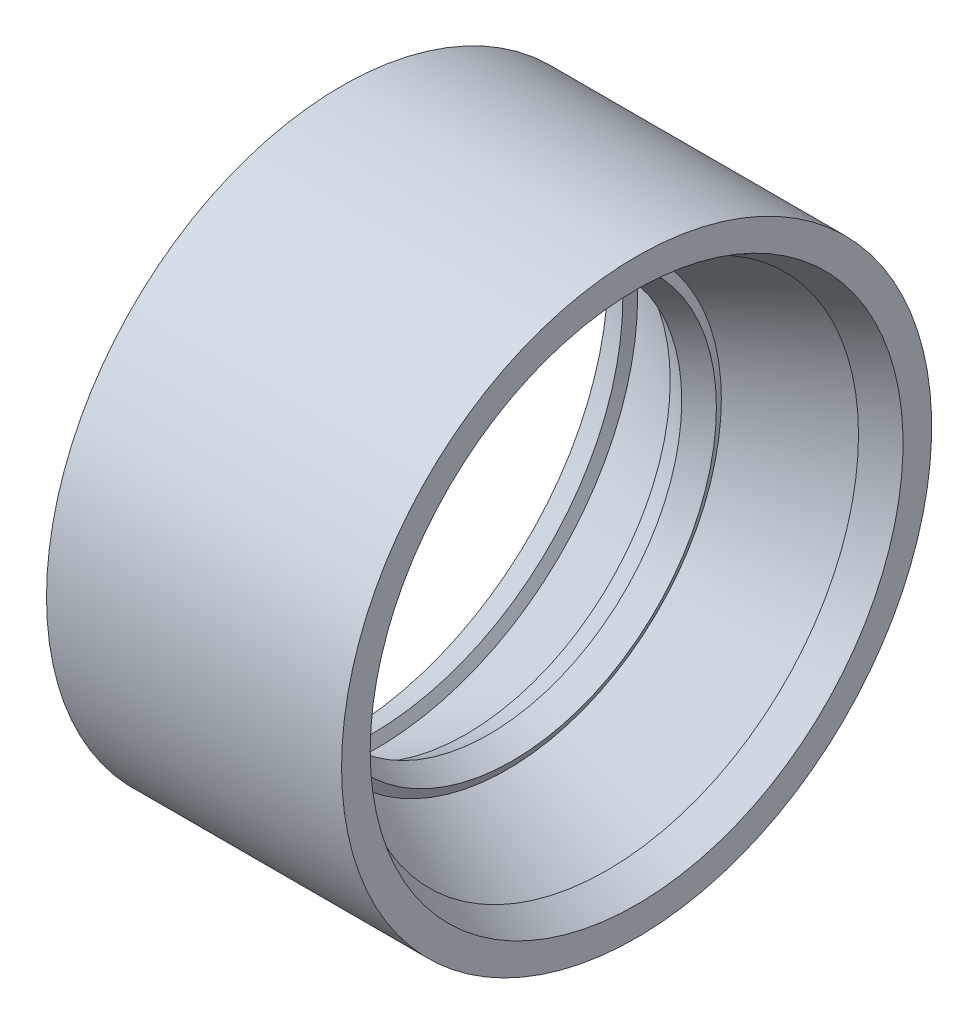
ISO-10303-21;
HEADER;
FILE_DESCRIPTION(('STEP AP214'),'2;1');
FILE_NAME('part.step','',(''),(''),'','','');
FILE_SCHEMA(('AUTOMOTIVE_DESIGN { 1 0 10303 214 1 1 1 1 }'));
ENDSEC;
DATA;
#1=APPLICATION_CONTEXT('core data for automotive mechanical design processes');
#2=APPLICATION_PROTOCOL_DEFINITION('international standard','automotive_design',2000,#1);
#3=PRODUCT_CONTEXT('',#1,'mechanical');
#4=PRODUCT('Part','Part','',(#3));
#5=PRODUCT_RELATED_PRODUCT_CATEGORY('part','',(#4));
#6=PRODUCT_DEFINITION_FORMATION('','',#4);
#7=PRODUCT_DEFINITION_CONTEXT('part definition',#1,'design');
#8=PRODUCT_DEFINITION('design','',#6,#7);
#9=PRODUCT_DEFINITION_SHAPE('','',#8);
#10=(LENGTH_UNIT() NAMED_UNIT(*) SI_UNIT(.MILLI.,.METRE.));
#11=(NAMED_UNIT(*) PLANE_ANGLE_UNIT() SI_UNIT($,.RADIAN.));
#12=(NAMED_UNIT(*) SI_UNIT($,.STERADIAN.) SOLID_ANGLE_UNIT());
#13=UNCERTAINTY_MEASURE_WITH_UNIT(LENGTH_MEASURE(1.E-05),#10,'distance_accuracy_value','');
#14=(GEOMETRIC_REPRESENTATION_CONTEXT(3) GLOBAL_UNCERTAINTY_ASSIGNED_CONTEXT((#13)) GLOBAL_UNIT_ASSIGNED_CONTEXT((#10,
#11,#12)) REPRESENTATION_CONTEXT('',''));
#15=CARTESIAN_POINT('',(0.,0.,0.));
#16=DIRECTION('',(0.,0.,1.));
#17=DIRECTION('',(1.,0.,0.));
#18=AXIS2_PLACEMENT_3D('',#15,#16,#17);
#19=CARTESIAN_POINT('',(0.,23.8819660112501,0.));
#20=DIRECTION('',(-1.,0.,0.));
#21=DIRECTION('',(0.,0.,1.));
#22=AXIS2_PLACEMENT_3D('',#19,#20,#21);
#23=PLANE('',#22);
#24=CARTESIAN_POINT('',(0.,60.,0.));
#25=DIRECTION('',(-1.,0.,0.));
#26=DIRECTION('',(0.,0.,1.));
#27=AXIS2_PLACEMENT_3D('',#24,#25,#26);
#28=CIRCLE('',#27,40.);
#29=CARTESIAN_POINT('',(0.,60.,40.));
#30=VERTEX_POINT('',#29);
#31=EDGE_CURVE('E10',#30,#30,#28,.T.);
#32=ORIENTED_EDGE('',*,*,#31,.T.);
#33=EDGE_LOOP('',(#32));
#34=FACE_BOUND('',#33,.T.);
#35=CARTESIAN_POINT('',(0.,60.,0.));
#36=DIRECTION('',(-1.,0.,0.));
#37=DIRECTION('',(0.,0.,1.));
#38=AXIS2_PLACEMENT_3D('',#35,#36,#37);
#39=CIRCLE('',#38,36.1180339887499);
#40=CARTESIAN_POINT('',(0.,60.,36.1180339887499));
#41=VERTEX_POINT('',#40);
#42=EDGE_CURVE('E75',#41,#41,#39,.T.);
#43=ORIENTED_EDGE('',*,*,#42,.F.);
#44=EDGE_LOOP('',(#43));
#45=FACE_BOUND('',#44,.T.);
#46=ADVANCED_FACE('F32',(#34,#45),#23,.T.);
#47=CARTESIAN_POINT('',(-13.6673439354094,60.,0.));
#48=DIRECTION('',(-1.,0.,0.));
#49=DIRECTION('',(0.,0.,1.));
#50=AXIS2_PLACEMENT_3D('',#47,#48,#49);
#51=CYLINDRICAL_SURFACE('',#50,40.);
#52=CARTESIAN_POINT('',(40.,60.,0.));
#53=DIRECTION('',(-1.,0.,0.));
#54=DIRECTION('',(0.,0.,1.));
#55=AXIS2_PLACEMENT_3D('',#52,#53,#54);
#56=CIRCLE('',#55,40.);
#57=CARTESIAN_POINT('',(40.,60.,40.));
#58=VERTEX_POINT('',#57);
#59=EDGE_CURVE('E38',#58,#58,#56,.T.);
#60=ORIENTED_EDGE('',*,*,#59,.T.);
#61=EDGE_LOOP('',(#60));
#62=FACE_BOUND('',#61,.T.);
#63=ORIENTED_EDGE('',*,*,#31,.F.);
#64=EDGE_LOOP('',(#63));
#65=FACE_BOUND('',#64,.T.);
#66=ADVANCED_FACE('F83',(#62,#65),#51,.T.);
#67=CARTESIAN_POINT('',(40.,23.8819660112501,0.));
#68=DIRECTION('',(1.,0.,0.));
#69=DIRECTION('',(0.,0.,-1.));
#70=AXIS2_PLACEMENT_3D('',#67,#68,#69);
#71=PLANE('',#70);
#72=CARTESIAN_POINT('',(40.,60.,0.));
#73=DIRECTION('',(-1.,0.,0.));
#74=DIRECTION('',(0.,0.,1.));
#75=AXIS2_PLACEMENT_3D('',#72,#73,#74);
#76=CIRCLE('',#75,36.1180339887499);
#77=CARTESIAN_POINT('',(40.,60.,36.1180339887499));
#78=VERTEX_POINT('',#77);
#79=EDGE_CURVE('E42',#78,#78,#76,.T.);
#80=ORIENTED_EDGE('',*,*,#79,.T.);
#81=EDGE_LOOP('',(#80));
#82=FACE_BOUND('',#81,.T.);
#83=ORIENTED_EDGE('',*,*,#59,.F.);
#84=EDGE_LOOP('',(#83));
#85=FACE_BOUND('',#84,.T.);
#86=ADVANCED_FACE('F87',(#82,#85),#71,.T.);
#87=CARTESIAN_POINT('',(40.,60.,0.));
#88=DIRECTION('',(1.,0.,0.));
#89=DIRECTION('',(0.,0.,-1.));
#90=AXIS2_PLACEMENT_3D('',#87,#88,#89);
#91=CONICAL_SURFACE('',#90,36.1180339887499,0.463647609000807);
#92=CARTESIAN_POINT('',(35.9750776405004,60.,0.));
#93=DIRECTION('',(-1.,0.,0.));
#94=DIRECTION('',(0.,0.,1.));
#95=AXIS2_PLACEMENT_3D('',#92,#93,#94);
#96=CIRCLE('',#95,34.1055728090001);
#97=CARTESIAN_POINT('',(35.9750776405004,60.,34.1055728090001));
#98=VERTEX_POINT('',#97);
#99=EDGE_CURVE('E46',#98,#98,#96,.T.);
#100=ORIENTED_EDGE('',*,*,#99,.T.);
#101=EDGE_LOOP('',(#100));
#102=FACE_BOUND('',#101,.T.);
#103=ORIENTED_EDGE('',*,*,#79,.F.);
#104=EDGE_LOOP('',(#103));
#105=FACE_BOUND('',#104,.T.);
#106=ADVANCED_FACE('F91',(#102,#105),#91,.F.);
#107=CARTESIAN_POINT('',(35.9750776405004,60.,0.));
#108=DIRECTION('',(-1.,0.,0.));
#109=DIRECTION('',(0.,0.,1.));
#110=AXIS2_PLACEMENT_3D('',#107,#108,#109);
#111=CONICAL_SURFACE('',#110,34.1055728090001,1.10714871779409);
#112=CARTESIAN_POINT('',(35.3042572472504,60.,0.));
#113=DIRECTION('',(-1.,0.,0.));
#114=DIRECTION('',(0.,0.,1.));
#115=AXIS2_PLACEMENT_3D('',#112,#113,#114);
#116=CIRCLE('',#115,35.4472135955);
#117=CARTESIAN_POINT('',(35.3042572472504,60.,35.4472135955));
#118=VERTEX_POINT('',#117);
#119=EDGE_CURVE('E51',#118,#118,#116,.T.);
#120=ORIENTED_EDGE('',*,*,#119,.T.);
#121=EDGE_LOOP('',(#120));
#122=FACE_BOUND('',#121,.T.);
#123=ORIENTED_EDGE('',*,*,#99,.F.);
#124=EDGE_LOOP('',(#123));
#125=FACE_BOUND('',#124,.T.);
#126=ADVANCED_FACE('F98',(#122,#125),#111,.F.);
#127=CARTESIAN_POINT('',(35.3042572472504,60.,0.));
#128=DIRECTION('',(1.,0.,0.));
#129=DIRECTION('',(0.,0.,-1.));
#130=AXIS2_PLACEMENT_3D('',#127,#128,#129);
#131=CONICAL_SURFACE('',#130,35.4472135955,0.463647609000806);
#132=CARTESIAN_POINT('',(22.4596747752498,60.,0.));
#133=DIRECTION('',(-1.,0.,0.));
#134=DIRECTION('',(0.,0.,1.));
#135=AXIS2_PLACEMENT_3D('',#132,#133,#134);
#136=CIRCLE('',#135,29.0249223594996);
#137=CARTESIAN_POINT('',(22.4596747752498,60.,29.0249223594996));
#138=VERTEX_POINT('',#137);
#139=EDGE_CURVE('E54',#138,#138,#136,.T.);
#140=ORIENTED_EDGE('',*,*,#139,.T.);
#141=EDGE_LOOP('',(#140));
#142=FACE_BOUND('',#141,.T.);
#143=ORIENTED_EDGE('',*,*,#119,.F.);
#144=EDGE_LOOP('',(#143));
#145=FACE_BOUND('',#144,.T.);
#146=ADVANCED_FACE('F102',(#142,#145),#131,.F.);
#147=CARTESIAN_POINT('',(22.4596747752498,60.,0.));
#148=DIRECTION('',(-1.,0.,0.));
#149=DIRECTION('',(0.,0.,1.));
#150=AXIS2_PLACEMENT_3D('',#147,#148,#149);
#151=CONICAL_SURFACE('',#150,29.0249223594996,1.10714871779409);
#152=CARTESIAN_POINT('',(23.1304951684997,60.,0.));
#153=DIRECTION('',(-1.,0.,0.));
#154=DIRECTION('',(0.,0.,1.));
#155=AXIS2_PLACEMENT_3D('',#152,#153,#154);
#156=CIRCLE('',#155,27.6832815729997);
#157=CARTESIAN_POINT('',(23.1304951684997,60.,27.6832815729997));
#158=VERTEX_POINT('',#157);
#159=EDGE_CURVE('E57',#158,#158,#156,.T.);
#160=ORIENTED_EDGE('',*,*,#159,.T.);
#161=EDGE_LOOP('',(#160));
#162=FACE_BOUND('',#161,.T.);
#163=ORIENTED_EDGE('',*,*,#139,.F.);
#164=EDGE_LOOP('',(#163));
#165=FACE_BOUND('',#164,.T.);
#166=ADVANCED_FACE('F106',(#162,#165),#151,.T.);
#167=CARTESIAN_POINT('',(23.1304951684997,60.,0.));
#168=DIRECTION('',(1.,0.,0.));
#169=DIRECTION('',(0.,0.,-1.));
#170=AXIS2_PLACEMENT_3D('',#167,#168,#169);
#171=CONICAL_SURFACE('',#170,27.6832815729997,0.463647609000807);
#172=CARTESIAN_POINT('',(20.,60.,0.));
#173=DIRECTION('',(-1.,0.,0.));
#174=DIRECTION('',(0.,0.,1.));
#175=AXIS2_PLACEMENT_3D('',#172,#173,#174);
#176=CIRCLE('',#175,26.1180339887499);
#177=CARTESIAN_POINT('',(20.,60.,26.1180339887499));
#178=VERTEX_POINT('',#177);
#179=EDGE_CURVE('E60',#178,#178,#176,.T.);
#180=ORIENTED_EDGE('',*,*,#179,.T.);
#181=EDGE_LOOP('',(#180));
#182=FACE_BOUND('',#181,.T.);
#183=ORIENTED_EDGE('',*,*,#159,.F.);
#184=EDGE_LOOP('',(#183));
#185=FACE_BOUND('',#184,.T.);
#186=ADVANCED_FACE('F110',(#182,#185),#171,.F.);
#187=CARTESIAN_POINT('',(20.,60.,0.));
#188=DIRECTION('',(-1.,0.,0.));
#189=DIRECTION('',(0.,0.,1.));
#190=AXIS2_PLACEMENT_3D('',#187,#188,#189);
#191=CONICAL_SURFACE('',#190,26.1180339887499,0.463647609000805);
#192=CARTESIAN_POINT('',(16.8695048315003,60.,0.));
#193=DIRECTION('',(-1.,0.,0.));
#194=DIRECTION('',(0.,0.,1.));
#195=AXIS2_PLACEMENT_3D('',#192,#193,#194);
#196=CIRCLE('',#195,27.6832815729997);
#197=CARTESIAN_POINT('',(16.8695048315003,60.,27.6832815729997));
#198=VERTEX_POINT('',#197);
#199=EDGE_CURVE('E63',#198,#198,#196,.T.);
#200=ORIENTED_EDGE('',*,*,#199,.T.);
#201=EDGE_LOOP('',(#200));
#202=FACE_BOUND('',#201,.T.);
#203=ORIENTED_EDGE('',*,*,#179,.F.);
#204=EDGE_LOOP('',(#203));
#205=FACE_BOUND('',#204,.T.);
#206=ADVANCED_FACE('F114',(#202,#205),#191,.F.);
#207=CARTESIAN_POINT('',(16.8695048315003,60.,0.));
#208=DIRECTION('',(1.,0.,0.));
#209=DIRECTION('',(0.,0.,-1.));
#210=AXIS2_PLACEMENT_3D('',#207,#208,#209);
#211=CONICAL_SURFACE('',#210,27.6832815729997,1.10714871779409);
#212=CARTESIAN_POINT('',(17.5403252247502,60.,0.));
#213=DIRECTION('',(-1.,0.,0.));
#214=DIRECTION('',(0.,0.,1.));
#215=AXIS2_PLACEMENT_3D('',#212,#213,#214);
#216=CIRCLE('',#215,29.0249223594996);
#217=CARTESIAN_POINT('',(17.5403252247502,60.,29.0249223594996));
#218=VERTEX_POINT('',#217);
#219=EDGE_CURVE('E66',#218,#218,#216,.T.);
#220=ORIENTED_EDGE('',*,*,#219,.T.);
#221=EDGE_LOOP('',(#220));
#222=FACE_BOUND('',#221,.T.);
#223=ORIENTED_EDGE('',*,*,#199,.F.);
#224=EDGE_LOOP('',(#223));
#225=FACE_BOUND('',#224,.T.);
#226=ADVANCED_FACE('F118',(#222,#225),#211,.T.);
#227=CARTESIAN_POINT('',(17.5403252247502,60.,0.));
#228=DIRECTION('',(-1.,0.,0.));
#229=DIRECTION('',(0.,0.,1.));
#230=AXIS2_PLACEMENT_3D('',#227,#228,#229);
#231=CONICAL_SURFACE('',#230,29.0249223594996,0.46364760900081);
#232=CARTESIAN_POINT('',(4.69574275274956,60.,0.));
#233=DIRECTION('',(-1.,0.,0.));
#234=DIRECTION('',(0.,0.,1.));
#235=AXIS2_PLACEMENT_3D('',#232,#233,#234);
#236=CIRCLE('',#235,35.4472135954999);
#237=CARTESIAN_POINT('',(4.69574275274956,60.,35.4472135954999));
#238=VERTEX_POINT('',#237);
#239=EDGE_CURVE('E69',#238,#238,#236,.T.);
#240=ORIENTED_EDGE('',*,*,#239,.T.);
#241=EDGE_LOOP('',(#240));
#242=FACE_BOUND('',#241,.T.);
#243=ORIENTED_EDGE('',*,*,#219,.F.);
#244=EDGE_LOOP('',(#243));
#245=FACE_BOUND('',#244,.T.);
#246=ADVANCED_FACE('F122',(#242,#245),#231,.F.);
#247=CARTESIAN_POINT('',(4.69574275274956,60.,0.));
#248=DIRECTION('',(1.,0.,0.));
#249=DIRECTION('',(0.,0.,-1.));
#250=AXIS2_PLACEMENT_3D('',#247,#248,#249);
#251=CONICAL_SURFACE('',#250,35.4472135954999,1.10714871779409);
#252=CARTESIAN_POINT('',(4.02492235949961,60.,0.));
#253=DIRECTION('',(-1.,0.,0.));
#254=DIRECTION('',(0.,0.,1.));
#255=AXIS2_PLACEMENT_3D('',#252,#253,#254);
#256=CIRCLE('',#255,34.1055728090001);
#257=CARTESIAN_POINT('',(4.02492235949961,60.,34.1055728090001));
#258=VERTEX_POINT('',#257);
#259=EDGE_CURVE('E72',#258,#258,#256,.T.);
#260=ORIENTED_EDGE('',*,*,#259,.T.);
#261=EDGE_LOOP('',(#260));
#262=FACE_BOUND('',#261,.T.);
#263=ORIENTED_EDGE('',*,*,#239,.F.);
#264=EDGE_LOOP('',(#263));
#265=FACE_BOUND('',#264,.T.);
#266=ADVANCED_FACE('F126',(#262,#265),#251,.F.);
#267=CARTESIAN_POINT('',(4.02492235949961,60.,0.));
#268=DIRECTION('',(-1.,0.,0.));
#269=DIRECTION('',(0.,0.,1.));
#270=AXIS2_PLACEMENT_3D('',#267,#268,#269);
#271=CONICAL_SURFACE('',#270,34.1055728090001,0.463647609000809);
#272=ORIENTED_EDGE('',*,*,#42,.T.);
#273=EDGE_LOOP('',(#272));
#274=FACE_BOUND('',#273,.T.);
#275=ORIENTED_EDGE('',*,*,#259,.F.);
#276=EDGE_LOOP('',(#275));
#277=FACE_BOUND('',#276,.T.);
#278=ADVANCED_FACE('F79',(#274,#277),#271,.F.);
#279=CLOSED_SHELL('',(#46,#66,#86,#106,#126,#146,#166,#186,#206,#226,#246,#266,#278));
#280=MANIFOLD_SOLID_BREP('B2',#279);
#281=ADVANCED_BREP_SHAPE_REPRESENTATION('',(#18,#280),#14);
#282=SHAPE_DEFINITION_REPRESENTATION(#9,#281);
ENDSEC;
END-ISO-10303-21;
